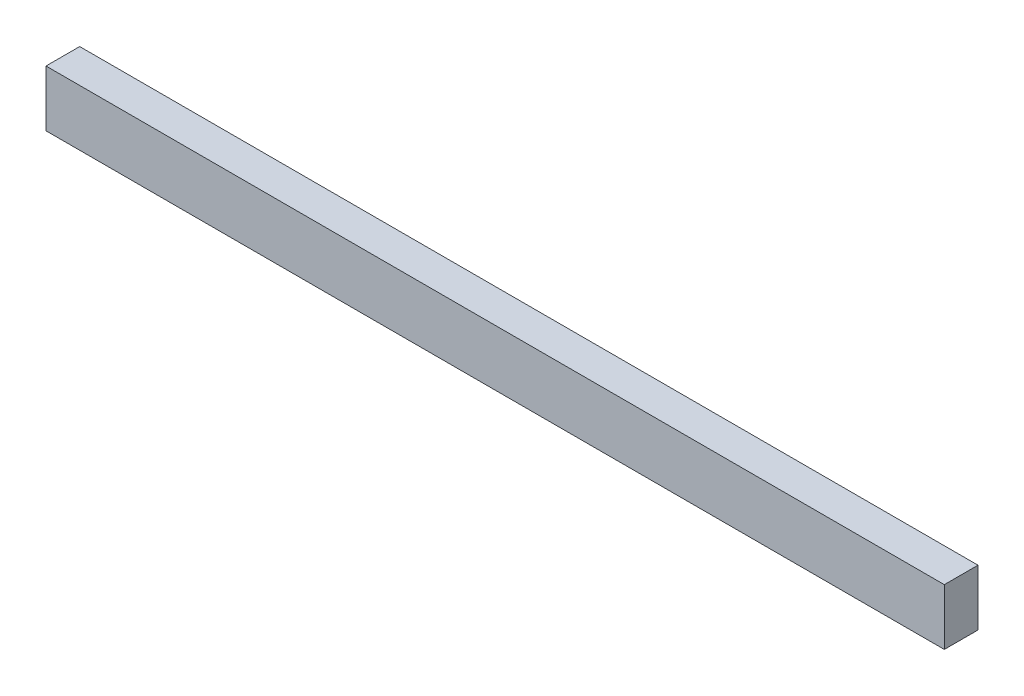
ISO-10303-21;
HEADER;
FILE_DESCRIPTION(('STEP AP214'),'2;1');
FILE_NAME('part.step','',(''),(''),'','','');
FILE_SCHEMA(('AUTOMOTIVE_DESIGN { 1 0 10303 214 1 1 1 1 }'));
ENDSEC;
DATA;
#1=APPLICATION_CONTEXT('core data for automotive mechanical design processes');
#2=APPLICATION_PROTOCOL_DEFINITION('international standard','automotive_design',2000,#1);
#3=PRODUCT_CONTEXT('',#1,'mechanical');
#4=PRODUCT('Part','Part','',(#3));
#5=PRODUCT_RELATED_PRODUCT_CATEGORY('part','',(#4));
#6=PRODUCT_DEFINITION_FORMATION('','',#4);
#7=PRODUCT_DEFINITION_CONTEXT('part definition',#1,'design');
#8=PRODUCT_DEFINITION('design','',#6,#7);
#9=PRODUCT_DEFINITION_SHAPE('','',#8);
#10=(LENGTH_UNIT() NAMED_UNIT(*) SI_UNIT(.MILLI.,.METRE.));
#11=(NAMED_UNIT(*) PLANE_ANGLE_UNIT() SI_UNIT($,.RADIAN.));
#12=(NAMED_UNIT(*) SI_UNIT($,.STERADIAN.) SOLID_ANGLE_UNIT());
#13=UNCERTAINTY_MEASURE_WITH_UNIT(LENGTH_MEASURE(1.E-05),#10,'distance_accuracy_value','');
#14=(GEOMETRIC_REPRESENTATION_CONTEXT(3) GLOBAL_UNCERTAINTY_ASSIGNED_CONTEXT((#13)) GLOBAL_UNIT_ASSIGNED_CONTEXT((#10,
#11,#12)) REPRESENTATION_CONTEXT('',''));
#15=CARTESIAN_POINT('',(0.,0.,0.));
#16=DIRECTION('',(0.,0.,1.));
#17=DIRECTION('',(1.,0.,0.));
#18=AXIS2_PLACEMENT_3D('',#15,#16,#17);
#19=CARTESIAN_POINT('',(-40.,2.5,3.));
#20=DIRECTION('',(1.,0.,0.));
#21=DIRECTION('',(0.,1.,0.));
#22=AXIS2_PLACEMENT_3D('',#19,#20,#21);
#23=PLANE('',#22);
#24=DIRECTION('',(0.,-1.,0.));
#25=VECTOR('',#24,1.);
#26=CARTESIAN_POINT('',(-40.,2.5,0.));
#27=LINE('',#26,#25);
#28=CARTESIAN_POINT('',(-40.,2.5,0.));
#29=VERTEX_POINT('',#28);
#30=CARTESIAN_POINT('',(-40.,-2.5,0.));
#31=VERTEX_POINT('',#30);
#32=EDGE_CURVE('E95',#29,#31,#27,.T.);
#33=ORIENTED_EDGE('',*,*,#32,.T.);
#34=DIRECTION('',(0.,0.,-1.));
#35=VECTOR('',#34,1.);
#36=CARTESIAN_POINT('',(-40.,-2.5,3.));
#37=LINE('',#36,#35);
#38=CARTESIAN_POINT('',(-40.,-2.5,3.));
#39=VERTEX_POINT('',#38);
#40=EDGE_CURVE('E11',#39,#31,#37,.T.);
#41=ORIENTED_EDGE('',*,*,#40,.F.);
#42=DIRECTION('',(0.,-1.,0.));
#43=VECTOR('',#42,1.);
#44=CARTESIAN_POINT('',(-40.,2.5,3.));
#45=LINE('',#44,#43);
#46=CARTESIAN_POINT('',(-40.,2.5,3.));
#47=VERTEX_POINT('',#46);
#48=EDGE_CURVE('E83',#47,#39,#45,.T.);
#49=ORIENTED_EDGE('',*,*,#48,.F.);
#50=DIRECTION('',(0.,0.,-1.));
#51=VECTOR('',#50,1.);
#52=CARTESIAN_POINT('',(-40.,2.5,3.));
#53=LINE('',#52,#51);
#54=EDGE_CURVE('E91',#47,#29,#53,.T.);
#55=ORIENTED_EDGE('',*,*,#54,.T.);
#56=EDGE_LOOP('',(#33,#41,#49,#55));
#57=FACE_BOUND('',#56,.T.);
#58=ADVANCED_FACE('F32',(#57),#23,.F.);
#59=CARTESIAN_POINT('',(-40.,-2.5,3.));
#60=DIRECTION('',(0.,1.,0.));
#61=DIRECTION('',(-1.,0.,0.));
#62=AXIS2_PLACEMENT_3D('',#59,#60,#61);
#63=PLANE('',#62);
#64=DIRECTION('',(1.,0.,0.));
#65=VECTOR('',#64,1.);
#66=CARTESIAN_POINT('',(-40.,-2.5,0.));
#67=LINE('',#66,#65);
#68=CARTESIAN_POINT('',(40.,-2.49999999999999,0.));
#69=VERTEX_POINT('',#68);
#70=EDGE_CURVE('E87',#31,#69,#67,.T.);
#71=ORIENTED_EDGE('',*,*,#70,.T.);
#72=DIRECTION('',(0.,0.,-1.));
#73=VECTOR('',#72,1.);
#74=CARTESIAN_POINT('',(40.,-2.49999999999999,3.));
#75=LINE('',#74,#73);
#76=CARTESIAN_POINT('',(40.,-2.49999999999999,3.));
#77=VERTEX_POINT('',#76);
#78=EDGE_CURVE('E40',#77,#69,#75,.T.);
#79=ORIENTED_EDGE('',*,*,#78,.F.);
#80=DIRECTION('',(1.,0.,0.));
#81=VECTOR('',#80,1.);
#82=CARTESIAN_POINT('',(-40.,-2.5,3.));
#83=LINE('',#82,#81);
#84=EDGE_CURVE('E78',#39,#77,#83,.T.);
#85=ORIENTED_EDGE('',*,*,#84,.F.);
#86=ORIENTED_EDGE('',*,*,#40,.T.);
#87=EDGE_LOOP('',(#71,#79,#85,#86));
#88=FACE_BOUND('',#87,.T.);
#89=ADVANCED_FACE('F86',(#88),#63,.F.);
#90=CARTESIAN_POINT('',(40.,2.50000000000001,3.));
#91=DIRECTION('',(-1.,0.,0.));
#92=DIRECTION('',(0.,-1.,0.));
#93=AXIS2_PLACEMENT_3D('',#90,#91,#92);
#94=PLANE('',#93);
#95=DIRECTION('',(0.,1.,0.));
#96=VECTOR('',#95,1.);
#97=CARTESIAN_POINT('',(40.,2.50000000000001,0.));
#98=LINE('',#97,#96);
#99=CARTESIAN_POINT('',(40.,2.50000000000001,0.));
#100=VERTEX_POINT('',#99);
#101=EDGE_CURVE('E65',#69,#100,#98,.T.);
#102=ORIENTED_EDGE('',*,*,#101,.T.);
#103=DIRECTION('',(0.,0.,-1.));
#104=VECTOR('',#103,1.);
#105=CARTESIAN_POINT('',(40.,2.50000000000001,3.));
#106=LINE('',#105,#104);
#107=CARTESIAN_POINT('',(40.,2.50000000000001,3.));
#108=VERTEX_POINT('',#107);
#109=EDGE_CURVE('E88',#108,#100,#106,.T.);
#110=ORIENTED_EDGE('',*,*,#109,.F.);
#111=DIRECTION('',(0.,1.,0.));
#112=VECTOR('',#111,1.);
#113=CARTESIAN_POINT('',(40.,2.50000000000001,3.));
#114=LINE('',#113,#112);
#115=EDGE_CURVE('E81',#77,#108,#114,.T.);
#116=ORIENTED_EDGE('',*,*,#115,.F.);
#117=ORIENTED_EDGE('',*,*,#78,.T.);
#118=EDGE_LOOP('',(#102,#110,#116,#117));
#119=FACE_BOUND('',#118,.T.);
#120=ADVANCED_FACE('F89',(#119),#94,.F.);
#121=CARTESIAN_POINT('',(-40.,2.5,3.));
#122=DIRECTION('',(0.,-1.,0.));
#123=DIRECTION('',(1.,0.,0.));
#124=AXIS2_PLACEMENT_3D('',#121,#122,#123);
#125=PLANE('',#124);
#126=DIRECTION('',(-1.,0.,0.));
#127=VECTOR('',#126,1.);
#128=CARTESIAN_POINT('',(-40.,2.5,0.));
#129=LINE('',#128,#127);
#130=EDGE_CURVE('E71',#100,#29,#129,.T.);
#131=ORIENTED_EDGE('',*,*,#130,.T.);
#132=ORIENTED_EDGE('',*,*,#54,.F.);
#133=DIRECTION('',(-1.,0.,0.));
#134=VECTOR('',#133,1.);
#135=CARTESIAN_POINT('',(-40.,2.5,3.));
#136=LINE('',#135,#134);
#137=EDGE_CURVE('E48',#108,#47,#136,.T.);
#138=ORIENTED_EDGE('',*,*,#137,.F.);
#139=ORIENTED_EDGE('',*,*,#109,.T.);
#140=EDGE_LOOP('',(#131,#132,#138,#139));
#141=FACE_BOUND('',#140,.T.);
#142=ADVANCED_FACE('F102',(#141),#125,.F.);
#143=CARTESIAN_POINT('',(0.,0.,3.));
#144=DIRECTION('',(0.,0.,1.));
#145=DIRECTION('',(1.,0.,0.));
#146=AXIS2_PLACEMENT_3D('',#143,#144,#145);
#147=PLANE('',#146);
#148=ORIENTED_EDGE('',*,*,#48,.T.);
#149=ORIENTED_EDGE('',*,*,#84,.T.);
#150=ORIENTED_EDGE('',*,*,#115,.T.);
#151=ORIENTED_EDGE('',*,*,#137,.T.);
#152=EDGE_LOOP('',(#148,#149,#150,#151));
#153=FACE_BOUND('',#152,.T.);
#154=ADVANCED_FACE('F79',(#153),#147,.T.);
#155=CARTESIAN_POINT('',(0.,0.,0.));
#156=DIRECTION('',(0.,0.,1.));
#157=DIRECTION('',(1.,0.,0.));
#158=AXIS2_PLACEMENT_3D('',#155,#156,#157);
#159=PLANE('',#158);
#160=ORIENTED_EDGE('',*,*,#32,.F.);
#161=ORIENTED_EDGE('',*,*,#130,.F.);
#162=ORIENTED_EDGE('',*,*,#101,.F.);
#163=ORIENTED_EDGE('',*,*,#70,.F.);
#164=EDGE_LOOP('',(#160,#161,#162,#163));
#165=FACE_BOUND('',#164,.T.);
#166=ADVANCED_FACE('F105',(#165),#159,.F.);
#167=CLOSED_SHELL('',(#58,#89,#120,#142,#154,#166));
#168=MANIFOLD_SOLID_BREP('B2',#167);
#169=ADVANCED_BREP_SHAPE_REPRESENTATION('',(#18,#168),#14);
#170=SHAPE_DEFINITION_REPRESENTATION(#9,#169);
ENDSEC;
END-ISO-10303-21;
